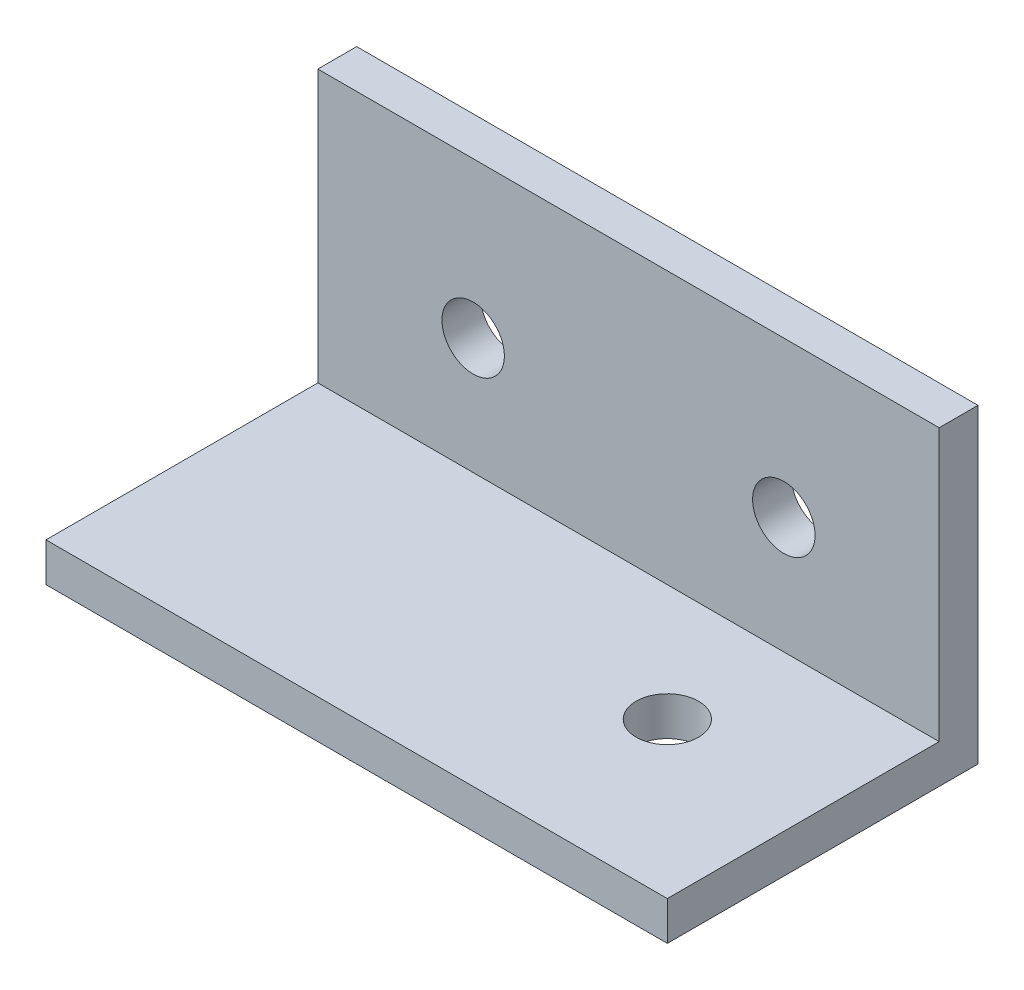
ISO-10303-21;
HEADER;
FILE_DESCRIPTION(('STEP AP214'),'2;1');
FILE_NAME('part.step','',(''),(''),'','','');
FILE_SCHEMA(('AUTOMOTIVE_DESIGN { 1 0 10303 214 1 1 1 1 }'));
ENDSEC;
DATA;
#1=APPLICATION_CONTEXT('core data for automotive mechanical design processes');
#2=APPLICATION_PROTOCOL_DEFINITION('international standard','automotive_design',2000,#1);
#3=PRODUCT_CONTEXT('',#1,'mechanical');
#4=PRODUCT('Part','Part','',(#3));
#5=PRODUCT_RELATED_PRODUCT_CATEGORY('part','',(#4));
#6=PRODUCT_DEFINITION_FORMATION('','',#4);
#7=PRODUCT_DEFINITION_CONTEXT('part definition',#1,'design');
#8=PRODUCT_DEFINITION('design','',#6,#7);
#9=PRODUCT_DEFINITION_SHAPE('','',#8);
#10=(LENGTH_UNIT() NAMED_UNIT(*) SI_UNIT(.MILLI.,.METRE.));
#11=(NAMED_UNIT(*) PLANE_ANGLE_UNIT() SI_UNIT($,.RADIAN.));
#12=(NAMED_UNIT(*) SI_UNIT($,.STERADIAN.) SOLID_ANGLE_UNIT());
#13=UNCERTAINTY_MEASURE_WITH_UNIT(LENGTH_MEASURE(1.E-05),#10,'distance_accuracy_value','');
#14=(GEOMETRIC_REPRESENTATION_CONTEXT(3) GLOBAL_UNCERTAINTY_ASSIGNED_CONTEXT((#13)) GLOBAL_UNIT_ASSIGNED_CONTEXT((#10,
#11,#12)) REPRESENTATION_CONTEXT('',''));
#15=CARTESIAN_POINT('',(0.,0.,0.));
#16=DIRECTION('',(0.,0.,1.));
#17=DIRECTION('',(1.,0.,0.));
#18=AXIS2_PLACEMENT_3D('',#15,#16,#17);
#19=CARTESIAN_POINT('',(50.8,38.1,0.));
#20=DIRECTION('',(0.,0.,-1.));
#21=DIRECTION('',(-1.,0.,0.));
#22=AXIS2_PLACEMENT_3D('',#19,#20,#21);
#23=PLANE('',#22);
#24=CARTESIAN_POINT('',(38.1,50.8,0.));
#25=DIRECTION('',(0.,0.,1.));
#26=DIRECTION('',(1.,0.,0.));
#27=AXIS2_PLACEMENT_3D('',#24,#25,#26);
#28=CIRCLE('',#27,2.55269999999998);
#29=CARTESIAN_POINT('',(40.6527,50.8,0.));
#30=VERTEX_POINT('',#29);
#31=EDGE_CURVE('E182',#30,#30,#28,.T.);
#32=ORIENTED_EDGE('',*,*,#31,.T.);
#33=EDGE_LOOP('',(#32));
#34=FACE_BOUND('',#33,.T.);
#35=CARTESIAN_POINT('',(12.7,50.8,0.));
#36=DIRECTION('',(0.,0.,1.));
#37=DIRECTION('',(1.,0.,0.));
#38=AXIS2_PLACEMENT_3D('',#35,#36,#37);
#39=CIRCLE('',#38,2.55269999999999);
#40=CARTESIAN_POINT('',(15.2527,50.8,0.));
#41=VERTEX_POINT('',#40);
#42=EDGE_CURVE('E174',#41,#41,#39,.T.);
#43=ORIENTED_EDGE('',*,*,#42,.T.);
#44=EDGE_LOOP('',(#43));
#45=FACE_BOUND('',#44,.T.);
#46=DIRECTION('',(-1.,0.,0.));
#47=VECTOR('',#46,1.);
#48=CARTESIAN_POINT('',(50.8,63.5,0.));
#49=LINE('',#48,#47);
#50=CARTESIAN_POINT('',(50.8,63.5,0.));
#51=VERTEX_POINT('',#50);
#52=CARTESIAN_POINT('',(0.,63.5,0.));
#53=VERTEX_POINT('',#52);
#54=EDGE_CURVE('E145',#51,#53,#49,.T.);
#55=ORIENTED_EDGE('',*,*,#54,.F.);
#56=DIRECTION('',(0.,1.,0.));
#57=VECTOR('',#56,1.);
#58=CARTESIAN_POINT('',(50.8,38.1,0.));
#59=LINE('',#58,#57);
#60=CARTESIAN_POINT('',(50.8,38.1,0.));
#61=VERTEX_POINT('',#60);
#62=EDGE_CURVE('E11',#61,#51,#59,.T.);
#63=ORIENTED_EDGE('',*,*,#62,.F.);
#64=DIRECTION('',(-1.,0.,0.));
#65=VECTOR('',#64,1.);
#66=CARTESIAN_POINT('',(50.8,38.1,0.));
#67=LINE('',#66,#65);
#68=CARTESIAN_POINT('',(0.,38.1,0.));
#69=VERTEX_POINT('',#68);
#70=EDGE_CURVE('E140',#61,#69,#67,.T.);
#71=ORIENTED_EDGE('',*,*,#70,.T.);
#72=DIRECTION('',(0.,1.,0.));
#73=VECTOR('',#72,1.);
#74=CARTESIAN_POINT('',(0.,38.1,0.));
#75=LINE('',#74,#73);
#76=EDGE_CURVE('E91',#69,#53,#75,.T.);
#77=ORIENTED_EDGE('',*,*,#76,.T.);
#78=EDGE_LOOP('',(#55,#63,#71,#77));
#79=FACE_BOUND('',#78,.T.);
#80=ADVANCED_FACE('F45',(#34,#45,#79),#23,.T.);
#81=CARTESIAN_POINT('',(50.8,38.1,25.4));
#82=DIRECTION('',(1.,0.,0.));
#83=DIRECTION('',(0.,0.,-1.));
#84=AXIS2_PLACEMENT_3D('',#81,#82,#83);
#85=PLANE('',#84);
#86=DIRECTION('',(0.,1.,0.));
#87=VECTOR('',#86,1.);
#88=CARTESIAN_POINT('',(50.8,41.275,3.175));
#89=LINE('',#88,#87);
#90=CARTESIAN_POINT('',(50.8,41.275,3.175));
#91=VERTEX_POINT('',#90);
#92=CARTESIAN_POINT('',(50.8,63.5,3.175));
#93=VERTEX_POINT('',#92);
#94=EDGE_CURVE('E62',#91,#93,#89,.T.);
#95=ORIENTED_EDGE('',*,*,#94,.F.);
#96=DIRECTION('',(0.,0.,-1.));
#97=VECTOR('',#96,1.);
#98=CARTESIAN_POINT('',(50.8,41.275,25.4));
#99=LINE('',#98,#97);
#100=CARTESIAN_POINT('',(50.8,41.275,25.4));
#101=VERTEX_POINT('',#100);
#102=EDGE_CURVE('E165',#101,#91,#99,.T.);
#103=ORIENTED_EDGE('',*,*,#102,.F.);
#104=DIRECTION('',(0.,1.,0.));
#105=VECTOR('',#104,1.);
#106=CARTESIAN_POINT('',(50.8,38.1,25.4));
#107=LINE('',#106,#105);
#108=CARTESIAN_POINT('',(50.8,38.1,25.4));
#109=VERTEX_POINT('',#108);
#110=EDGE_CURVE('E54',#109,#101,#107,.T.);
#111=ORIENTED_EDGE('',*,*,#110,.F.);
#112=DIRECTION('',(0.,0.,-1.));
#113=VECTOR('',#112,1.);
#114=CARTESIAN_POINT('',(50.8,38.1,25.4));
#115=LINE('',#114,#113);
#116=EDGE_CURVE('E136',#109,#61,#115,.T.);
#117=ORIENTED_EDGE('',*,*,#116,.T.);
#118=ORIENTED_EDGE('',*,*,#62,.T.);
#119=DIRECTION('',(0.,0.,-1.));
#120=VECTOR('',#119,1.);
#121=CARTESIAN_POINT('',(50.8,63.5,25.4));
#122=LINE('',#121,#120);
#123=EDGE_CURVE('E85',#93,#51,#122,.T.);
#124=ORIENTED_EDGE('',*,*,#123,.F.);
#125=EDGE_LOOP('',(#95,#103,#111,#117,#118,#124));
#126=FACE_BOUND('',#125,.T.);
#127=ADVANCED_FACE('F215',(#126),#85,.T.);
#128=CARTESIAN_POINT('',(0.,38.1,25.4));
#129=DIRECTION('',(0.,0.,1.));
#130=DIRECTION('',(1.,0.,0.));
#131=AXIS2_PLACEMENT_3D('',#128,#129,#130);
#132=PLANE('',#131);
#133=DIRECTION('',(1.,0.,0.));
#134=VECTOR('',#133,1.);
#135=CARTESIAN_POINT('',(0.,41.275,25.4));
#136=LINE('',#135,#134);
#137=CARTESIAN_POINT('',(0.,41.275,25.4));
#138=VERTEX_POINT('',#137);
#139=EDGE_CURVE('E112',#138,#101,#136,.T.);
#140=ORIENTED_EDGE('',*,*,#139,.F.);
#141=DIRECTION('',(0.,1.,0.));
#142=VECTOR('',#141,1.);
#143=CARTESIAN_POINT('',(0.,38.1,25.4));
#144=LINE('',#143,#142);
#145=CARTESIAN_POINT('',(0.,38.1,25.4));
#146=VERTEX_POINT('',#145);
#147=EDGE_CURVE('E125',#146,#138,#144,.T.);
#148=ORIENTED_EDGE('',*,*,#147,.F.);
#149=DIRECTION('',(1.,0.,0.));
#150=VECTOR('',#149,1.);
#151=CARTESIAN_POINT('',(0.,38.1,25.4));
#152=LINE('',#151,#150);
#153=EDGE_CURVE('E152',#146,#109,#152,.T.);
#154=ORIENTED_EDGE('',*,*,#153,.T.);
#155=ORIENTED_EDGE('',*,*,#110,.T.);
#156=EDGE_LOOP('',(#140,#148,#154,#155));
#157=FACE_BOUND('',#156,.T.);
#158=ADVANCED_FACE('F123',(#157),#132,.T.);
#159=CARTESIAN_POINT('',(0.,38.1,0.));
#160=DIRECTION('',(-1.,0.,0.));
#161=DIRECTION('',(0.,0.,1.));
#162=AXIS2_PLACEMENT_3D('',#159,#160,#161);
#163=PLANE('',#162);
#164=DIRECTION('',(0.,1.,0.));
#165=VECTOR('',#164,1.);
#166=CARTESIAN_POINT('',(0.,41.275,3.175));
#167=LINE('',#166,#165);
#168=CARTESIAN_POINT('',(0.,41.275,3.175));
#169=VERTEX_POINT('',#168);
#170=CARTESIAN_POINT('',(0.,63.5,3.175));
#171=VERTEX_POINT('',#170);
#172=EDGE_CURVE('E119',#169,#171,#167,.T.);
#173=ORIENTED_EDGE('',*,*,#172,.T.);
#174=DIRECTION('',(0.,0.,1.));
#175=VECTOR('',#174,1.);
#176=CARTESIAN_POINT('',(0.,63.5,0.));
#177=LINE('',#176,#175);
#178=EDGE_CURVE('E141',#53,#171,#177,.T.);
#179=ORIENTED_EDGE('',*,*,#178,.F.);
#180=ORIENTED_EDGE('',*,*,#76,.F.);
#181=DIRECTION('',(0.,0.,1.));
#182=VECTOR('',#181,1.);
#183=CARTESIAN_POINT('',(0.,38.1,0.));
#184=LINE('',#183,#182);
#185=EDGE_CURVE('E130',#69,#146,#184,.T.);
#186=ORIENTED_EDGE('',*,*,#185,.T.);
#187=ORIENTED_EDGE('',*,*,#147,.T.);
#188=DIRECTION('',(0.,0.,-1.));
#189=VECTOR('',#188,1.);
#190=CARTESIAN_POINT('',(0.,41.275,25.4));
#191=LINE('',#190,#189);
#192=EDGE_CURVE('E108',#138,#169,#191,.T.);
#193=ORIENTED_EDGE('',*,*,#192,.T.);
#194=EDGE_LOOP('',(#173,#179,#180,#186,#187,#193));
#195=FACE_BOUND('',#194,.T.);
#196=ADVANCED_FACE('F129',(#195),#163,.T.);
#197=CARTESIAN_POINT('',(0.,38.1,0.));
#198=DIRECTION('',(0.,1.,0.));
#199=DIRECTION('',(0.,0.,1.));
#200=AXIS2_PLACEMENT_3D('',#197,#198,#199);
#201=PLANE('',#200);
#202=CARTESIAN_POINT('',(38.1,38.1,12.7));
#203=DIRECTION('',(0.,-1.,0.));
#204=DIRECTION('',(0.,0.,-1.));
#205=AXIS2_PLACEMENT_3D('',#202,#203,#204);
#206=CIRCLE('',#205,2.55269999999998);
#207=CARTESIAN_POINT('',(38.1,38.1,10.1473));
#208=VERTEX_POINT('',#207);
#209=EDGE_CURVE('E170',#208,#208,#206,.T.);
#210=ORIENTED_EDGE('',*,*,#209,.F.);
#211=EDGE_LOOP('',(#210));
#212=FACE_BOUND('',#211,.T.);
#213=ORIENTED_EDGE('',*,*,#70,.F.);
#214=ORIENTED_EDGE('',*,*,#116,.F.);
#215=ORIENTED_EDGE('',*,*,#153,.F.);
#216=ORIENTED_EDGE('',*,*,#185,.F.);
#217=EDGE_LOOP('',(#213,#214,#215,#216));
#218=FACE_BOUND('',#217,.T.);
#219=ADVANCED_FACE('F226',(#212,#218),#201,.F.);
#220=CARTESIAN_POINT('',(0.,63.5,0.));
#221=DIRECTION('',(0.,1.,0.));
#222=DIRECTION('',(0.,0.,1.));
#223=AXIS2_PLACEMENT_3D('',#220,#221,#222);
#224=PLANE('',#223);
#225=DIRECTION('',(1.,0.,0.));
#226=VECTOR('',#225,1.);
#227=CARTESIAN_POINT('',(0.,63.5,3.175));
#228=LINE('',#227,#226);
#229=EDGE_CURVE('E148',#171,#93,#228,.T.);
#230=ORIENTED_EDGE('',*,*,#229,.T.);
#231=ORIENTED_EDGE('',*,*,#123,.T.);
#232=ORIENTED_EDGE('',*,*,#54,.T.);
#233=ORIENTED_EDGE('',*,*,#178,.T.);
#234=EDGE_LOOP('',(#230,#231,#232,#233));
#235=FACE_BOUND('',#234,.T.);
#236=ADVANCED_FACE('F196',(#235),#224,.T.);
#237=CARTESIAN_POINT('',(0.,41.275,3.175));
#238=DIRECTION('',(0.,0.,-1.));
#239=DIRECTION('',(-1.,0.,0.));
#240=AXIS2_PLACEMENT_3D('',#237,#238,#239);
#241=PLANE('',#240);
#242=CARTESIAN_POINT('',(38.1,50.8,3.175));
#243=DIRECTION('',(0.,0.,1.));
#244=DIRECTION('',(1.,0.,0.));
#245=AXIS2_PLACEMENT_3D('',#242,#243,#244);
#246=CIRCLE('',#245,2.55269999999998);
#247=CARTESIAN_POINT('',(40.6527,50.8,3.175));
#248=VERTEX_POINT('',#247);
#249=EDGE_CURVE('E186',#248,#248,#246,.T.);
#250=ORIENTED_EDGE('',*,*,#249,.F.);
#251=EDGE_LOOP('',(#250));
#252=FACE_BOUND('',#251,.T.);
#253=CARTESIAN_POINT('',(12.7,50.8,3.175));
#254=DIRECTION('',(0.,0.,1.));
#255=DIRECTION('',(1.,0.,0.));
#256=AXIS2_PLACEMENT_3D('',#253,#254,#255);
#257=CIRCLE('',#256,2.55269999999999);
#258=CARTESIAN_POINT('',(15.2527,50.8,3.175));
#259=VERTEX_POINT('',#258);
#260=EDGE_CURVE('E178',#259,#259,#257,.T.);
#261=ORIENTED_EDGE('',*,*,#260,.F.);
#262=EDGE_LOOP('',(#261));
#263=FACE_BOUND('',#262,.T.);
#264=ORIENTED_EDGE('',*,*,#94,.T.);
#265=ORIENTED_EDGE('',*,*,#229,.F.);
#266=ORIENTED_EDGE('',*,*,#172,.F.);
#267=DIRECTION('',(1.,0.,0.));
#268=VECTOR('',#267,1.);
#269=CARTESIAN_POINT('',(0.,41.275,3.175));
#270=LINE('',#269,#268);
#271=EDGE_CURVE('E114',#169,#91,#270,.T.);
#272=ORIENTED_EDGE('',*,*,#271,.T.);
#273=EDGE_LOOP('',(#264,#265,#266,#272));
#274=FACE_BOUND('',#273,.T.);
#275=ADVANCED_FACE('F193',(#252,#263,#274),#241,.F.);
#276=CARTESIAN_POINT('',(0.,41.275,25.4));
#277=DIRECTION('',(0.,-1.,0.));
#278=DIRECTION('',(0.,0.,-1.));
#279=AXIS2_PLACEMENT_3D('',#276,#277,#278);
#280=PLANE('',#279);
#281=CARTESIAN_POINT('',(38.1,41.275,12.7));
#282=DIRECTION('',(0.,-1.,0.));
#283=DIRECTION('',(0.,0.,-1.));
#284=AXIS2_PLACEMENT_3D('',#281,#282,#283);
#285=CIRCLE('',#284,2.55269999999998);
#286=CARTESIAN_POINT('',(38.1,41.275,10.1473));
#287=VERTEX_POINT('',#286);
#288=EDGE_CURVE('E48',#287,#287,#285,.T.);
#289=ORIENTED_EDGE('',*,*,#288,.T.);
#290=EDGE_LOOP('',(#289));
#291=FACE_BOUND('',#290,.T.);
#292=ORIENTED_EDGE('',*,*,#102,.T.);
#293=ORIENTED_EDGE('',*,*,#271,.F.);
#294=ORIENTED_EDGE('',*,*,#192,.F.);
#295=ORIENTED_EDGE('',*,*,#139,.T.);
#296=EDGE_LOOP('',(#292,#293,#294,#295));
#297=FACE_BOUND('',#296,.T.);
#298=ADVANCED_FACE('F111',(#291,#297),#280,.F.);
#299=CARTESIAN_POINT('',(38.1,38.1,12.7));
#300=DIRECTION('',(0.,-1.,0.));
#301=DIRECTION('',(0.,0.,-1.));
#302=AXIS2_PLACEMENT_3D('',#299,#300,#301);
#303=CYLINDRICAL_SURFACE('',#302,2.55269999999998);
#304=ORIENTED_EDGE('',*,*,#209,.T.);
#305=EDGE_LOOP('',(#304));
#306=FACE_BOUND('',#305,.T.);
#307=ORIENTED_EDGE('',*,*,#288,.F.);
#308=EDGE_LOOP('',(#307));
#309=FACE_BOUND('',#308,.T.);
#310=ADVANCED_FACE('F202',(#306,#309),#303,.F.);
#311=CARTESIAN_POINT('',(12.7,50.8,3.175));
#312=DIRECTION('',(0.,0.,1.));
#313=DIRECTION('',(1.,0.,0.));
#314=AXIS2_PLACEMENT_3D('',#311,#312,#313);
#315=CYLINDRICAL_SURFACE('',#314,2.55269999999999);
#316=ORIENTED_EDGE('',*,*,#42,.F.);
#317=EDGE_LOOP('',(#316));
#318=FACE_BOUND('',#317,.T.);
#319=ORIENTED_EDGE('',*,*,#260,.T.);
#320=EDGE_LOOP('',(#319));
#321=FACE_BOUND('',#320,.T.);
#322=ADVANCED_FACE('F200',(#318,#321),#315,.F.);
#323=CARTESIAN_POINT('',(38.1,50.8,3.175));
#324=DIRECTION('',(0.,0.,1.));
#325=DIRECTION('',(1.,0.,0.));
#326=AXIS2_PLACEMENT_3D('',#323,#324,#325);
#327=CYLINDRICAL_SURFACE('',#326,2.55269999999998);
#328=ORIENTED_EDGE('',*,*,#31,.F.);
#329=EDGE_LOOP('',(#328));
#330=FACE_BOUND('',#329,.T.);
#331=ORIENTED_EDGE('',*,*,#249,.T.);
#332=EDGE_LOOP('',(#331));
#333=FACE_BOUND('',#332,.T.);
#334=ADVANCED_FACE('F191',(#330,#333),#327,.F.);
#335=CLOSED_SHELL('',(#80,#127,#158,#196,#219,#236,#275,#298,#310,#322,#334));
#336=MANIFOLD_SOLID_BREP('B2',#335);
#337=ADVANCED_BREP_SHAPE_REPRESENTATION('',(#18,#336),#14);
#338=SHAPE_DEFINITION_REPRESENTATION(#9,#337);
ENDSEC;
END-ISO-10303-21;
